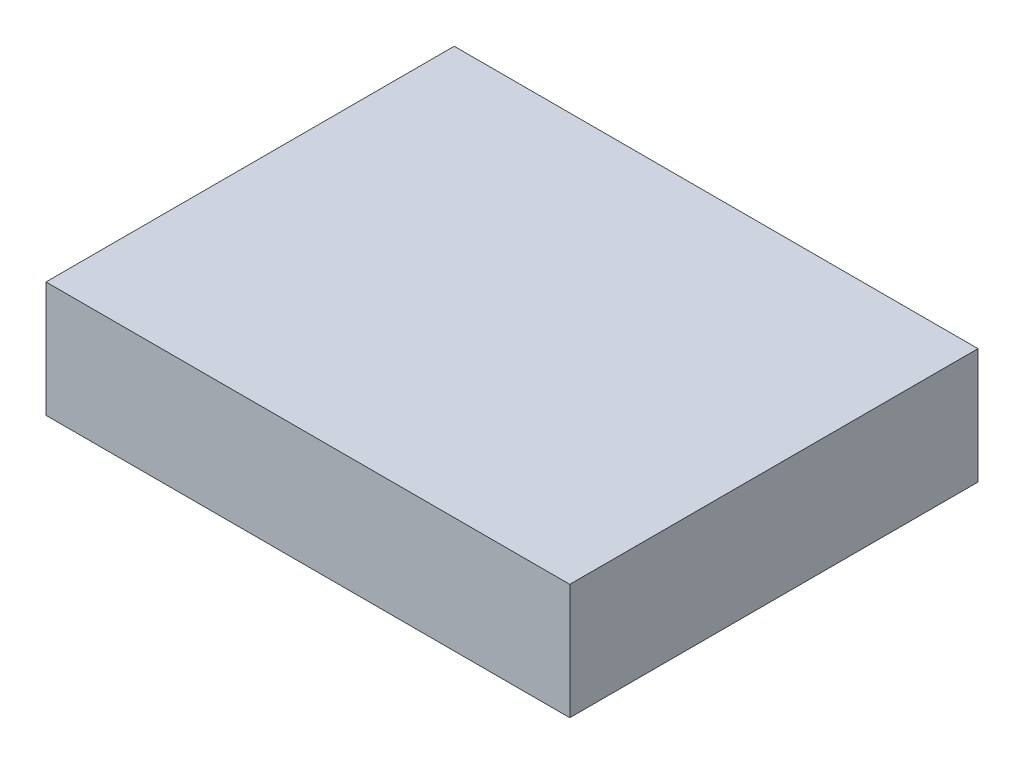
ISO-10303-21;
HEADER;
FILE_DESCRIPTION(('STEP AP214'),'2;1');
FILE_NAME('part.step','',(''),(''),'','','');
FILE_SCHEMA(('AUTOMOTIVE_DESIGN { 1 0 10303 214 1 1 1 1 }'));
ENDSEC;
DATA;
#1=APPLICATION_CONTEXT('core data for automotive mechanical design processes');
#2=APPLICATION_PROTOCOL_DEFINITION('international standard','automotive_design',2000,#1);
#3=PRODUCT_CONTEXT('',#1,'mechanical');
#4=PRODUCT('Part','Part','',(#3));
#5=PRODUCT_RELATED_PRODUCT_CATEGORY('part','',(#4));
#6=PRODUCT_DEFINITION_FORMATION('','',#4);
#7=PRODUCT_DEFINITION_CONTEXT('part definition',#1,'design');
#8=PRODUCT_DEFINITION('design','',#6,#7);
#9=PRODUCT_DEFINITION_SHAPE('','',#8);
#10=(LENGTH_UNIT() NAMED_UNIT(*) SI_UNIT(.MILLI.,.METRE.));
#11=(NAMED_UNIT(*) PLANE_ANGLE_UNIT() SI_UNIT($,.RADIAN.));
#12=(NAMED_UNIT(*) SI_UNIT($,.STERADIAN.) SOLID_ANGLE_UNIT());
#13=UNCERTAINTY_MEASURE_WITH_UNIT(LENGTH_MEASURE(1.E-05),#10,'distance_accuracy_value','');
#14=(GEOMETRIC_REPRESENTATION_CONTEXT(3) GLOBAL_UNCERTAINTY_ASSIGNED_CONTEXT((#13)) GLOBAL_UNIT_ASSIGNED_CONTEXT((#10,
#11,#12)) REPRESENTATION_CONTEXT('',''));
#15=CARTESIAN_POINT('',(0.,0.,0.));
#16=DIRECTION('',(0.,0.,1.));
#17=DIRECTION('',(1.,0.,0.));
#18=AXIS2_PLACEMENT_3D('',#15,#16,#17);
#19=CARTESIAN_POINT('',(33.9999999999999,15.,26.5));
#20=DIRECTION('',(-1.,0.,0.));
#21=DIRECTION('',(0.,0.,1.));
#22=AXIS2_PLACEMENT_3D('',#19,#20,#21);
#23=PLANE('',#22);
#24=DIRECTION('',(0.,0.,-1.));
#25=VECTOR('',#24,1.);
#26=CARTESIAN_POINT('',(33.9999999999999,0.,26.5));
#27=LINE('',#26,#25);
#28=CARTESIAN_POINT('',(33.9999999999999,0.,26.5));
#29=VERTEX_POINT('',#28);
#30=CARTESIAN_POINT('',(33.9999999999999,0.,-26.5));
#31=VERTEX_POINT('',#30);
#32=EDGE_CURVE('E96',#29,#31,#27,.T.);
#33=ORIENTED_EDGE('',*,*,#32,.T.);
#34=DIRECTION('',(0.,-1.,0.));
#35=VECTOR('',#34,1.);
#36=CARTESIAN_POINT('',(33.9999999999999,15.,-26.5));
#37=LINE('',#36,#35);
#38=CARTESIAN_POINT('',(33.9999999999999,15.,-26.5));
#39=VERTEX_POINT('',#38);
#40=EDGE_CURVE('E11',#39,#31,#37,.T.);
#41=ORIENTED_EDGE('',*,*,#40,.F.);
#42=DIRECTION('',(0.,0.,-1.));
#43=VECTOR('',#42,1.);
#44=CARTESIAN_POINT('',(33.9999999999999,15.,26.5));
#45=LINE('',#44,#43);
#46=CARTESIAN_POINT('',(33.9999999999999,15.,26.5));
#47=VERTEX_POINT('',#46);
#48=EDGE_CURVE('E84',#47,#39,#45,.T.);
#49=ORIENTED_EDGE('',*,*,#48,.F.);
#50=DIRECTION('',(0.,-1.,0.));
#51=VECTOR('',#50,1.);
#52=CARTESIAN_POINT('',(33.9999999999999,15.,26.5));
#53=LINE('',#52,#51);
#54=EDGE_CURVE('E92',#47,#29,#53,.T.);
#55=ORIENTED_EDGE('',*,*,#54,.T.);
#56=EDGE_LOOP('',(#33,#41,#49,#55));
#57=FACE_BOUND('',#56,.T.);
#58=ADVANCED_FACE('F33',(#57),#23,.F.);
#59=CARTESIAN_POINT('',(-34.,15.,-26.5));
#60=DIRECTION('',(0.,0.,1.));
#61=DIRECTION('',(1.,0.,0.));
#62=AXIS2_PLACEMENT_3D('',#59,#60,#61);
#63=PLANE('',#62);
#64=DIRECTION('',(-1.,0.,0.));
#65=VECTOR('',#64,1.);
#66=CARTESIAN_POINT('',(-34.,0.,-26.5));
#67=LINE('',#66,#65);
#68=CARTESIAN_POINT('',(-34.,0.,-26.5));
#69=VERTEX_POINT('',#68);
#70=EDGE_CURVE('E88',#31,#69,#67,.T.);
#71=ORIENTED_EDGE('',*,*,#70,.T.);
#72=DIRECTION('',(0.,-1.,0.));
#73=VECTOR('',#72,1.);
#74=CARTESIAN_POINT('',(-34.,15.,-26.5));
#75=LINE('',#74,#73);
#76=CARTESIAN_POINT('',(-34.,15.,-26.5));
#77=VERTEX_POINT('',#76);
#78=EDGE_CURVE('E41',#77,#69,#75,.T.);
#79=ORIENTED_EDGE('',*,*,#78,.F.);
#80=DIRECTION('',(-1.,0.,0.));
#81=VECTOR('',#80,1.);
#82=CARTESIAN_POINT('',(-34.,15.,-26.5));
#83=LINE('',#82,#81);
#84=EDGE_CURVE('E79',#39,#77,#83,.T.);
#85=ORIENTED_EDGE('',*,*,#84,.F.);
#86=ORIENTED_EDGE('',*,*,#40,.T.);
#87=EDGE_LOOP('',(#71,#79,#85,#86));
#88=FACE_BOUND('',#87,.T.);
#89=ADVANCED_FACE('F87',(#88),#63,.F.);
#90=CARTESIAN_POINT('',(-34.,15.,26.5));
#91=DIRECTION('',(1.,0.,0.));
#92=DIRECTION('',(0.,0.,-1.));
#93=AXIS2_PLACEMENT_3D('',#90,#91,#92);
#94=PLANE('',#93);
#95=DIRECTION('',(0.,0.,1.));
#96=VECTOR('',#95,1.);
#97=CARTESIAN_POINT('',(-34.,0.,26.5));
#98=LINE('',#97,#96);
#99=CARTESIAN_POINT('',(-34.,0.,26.5));
#100=VERTEX_POINT('',#99);
#101=EDGE_CURVE('E66',#69,#100,#98,.T.);
#102=ORIENTED_EDGE('',*,*,#101,.T.);
#103=DIRECTION('',(0.,-1.,0.));
#104=VECTOR('',#103,1.);
#105=CARTESIAN_POINT('',(-34.,15.,26.5));
#106=LINE('',#105,#104);
#107=CARTESIAN_POINT('',(-34.,15.,26.5));
#108=VERTEX_POINT('',#107);
#109=EDGE_CURVE('E89',#108,#100,#106,.T.);
#110=ORIENTED_EDGE('',*,*,#109,.F.);
#111=DIRECTION('',(0.,0.,1.));
#112=VECTOR('',#111,1.);
#113=CARTESIAN_POINT('',(-34.,15.,26.5));
#114=LINE('',#113,#112);
#115=EDGE_CURVE('E82',#77,#108,#114,.T.);
#116=ORIENTED_EDGE('',*,*,#115,.F.);
#117=ORIENTED_EDGE('',*,*,#78,.T.);
#118=EDGE_LOOP('',(#102,#110,#116,#117));
#119=FACE_BOUND('',#118,.T.);
#120=ADVANCED_FACE('F90',(#119),#94,.F.);
#121=CARTESIAN_POINT('',(-34.,15.,26.5));
#122=DIRECTION('',(0.,0.,-1.));
#123=DIRECTION('',(-1.,0.,0.));
#124=AXIS2_PLACEMENT_3D('',#121,#122,#123);
#125=PLANE('',#124);
#126=DIRECTION('',(1.,0.,0.));
#127=VECTOR('',#126,1.);
#128=CARTESIAN_POINT('',(-34.,0.,26.5));
#129=LINE('',#128,#127);
#130=EDGE_CURVE('E72',#100,#29,#129,.T.);
#131=ORIENTED_EDGE('',*,*,#130,.T.);
#132=ORIENTED_EDGE('',*,*,#54,.F.);
#133=DIRECTION('',(1.,0.,0.));
#134=VECTOR('',#133,1.);
#135=CARTESIAN_POINT('',(-34.,15.,26.5));
#136=LINE('',#135,#134);
#137=EDGE_CURVE('E49',#108,#47,#136,.T.);
#138=ORIENTED_EDGE('',*,*,#137,.F.);
#139=ORIENTED_EDGE('',*,*,#109,.T.);
#140=EDGE_LOOP('',(#131,#132,#138,#139));
#141=FACE_BOUND('',#140,.T.);
#142=ADVANCED_FACE('F103',(#141),#125,.F.);
#143=CARTESIAN_POINT('',(0.,15.,0.));
#144=DIRECTION('',(0.,-1.,0.));
#145=DIRECTION('',(0.,0.,-1.));
#146=AXIS2_PLACEMENT_3D('',#143,#144,#145);
#147=PLANE('',#146);
#148=ORIENTED_EDGE('',*,*,#48,.T.);
#149=ORIENTED_EDGE('',*,*,#84,.T.);
#150=ORIENTED_EDGE('',*,*,#115,.T.);
#151=ORIENTED_EDGE('',*,*,#137,.T.);
#152=EDGE_LOOP('',(#148,#149,#150,#151));
#153=FACE_BOUND('',#152,.T.);
#154=ADVANCED_FACE('F80',(#153),#147,.F.);
#155=CARTESIAN_POINT('',(0.,0.,0.));
#156=DIRECTION('',(0.,-1.,0.));
#157=DIRECTION('',(0.,0.,-1.));
#158=AXIS2_PLACEMENT_3D('',#155,#156,#157);
#159=PLANE('',#158);
#160=ORIENTED_EDGE('',*,*,#32,.F.);
#161=ORIENTED_EDGE('',*,*,#130,.F.);
#162=ORIENTED_EDGE('',*,*,#101,.F.);
#163=ORIENTED_EDGE('',*,*,#70,.F.);
#164=EDGE_LOOP('',(#160,#161,#162,#163));
#165=FACE_BOUND('',#164,.T.);
#166=ADVANCED_FACE('F106',(#165),#159,.T.);
#167=CLOSED_SHELL('',(#58,#89,#120,#142,#154,#166));
#168=MANIFOLD_SOLID_BREP('B2',#167);
#169=ADVANCED_BREP_SHAPE_REPRESENTATION('',(#18,#168),#14);
#170=SHAPE_DEFINITION_REPRESENTATION(#9,#169);
ENDSEC;
END-ISO-10303-21;
